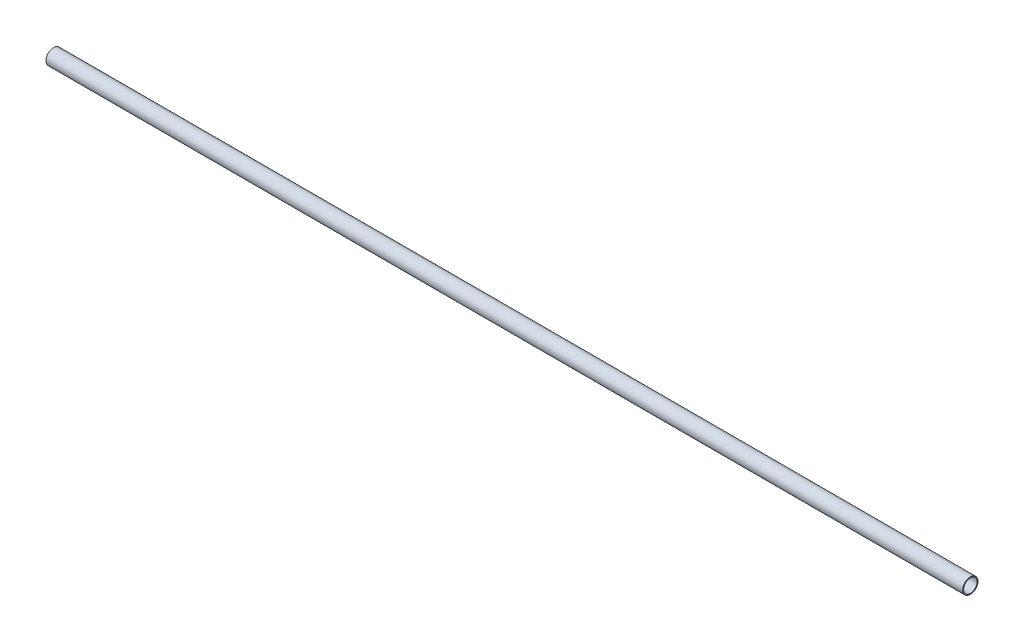
ISO-10303-21;
HEADER;
FILE_DESCRIPTION(('STEP AP214'),'2;1');
FILE_NAME('part.step','',(''),(''),'','','');
FILE_SCHEMA(('AUTOMOTIVE_DESIGN { 1 0 10303 214 1 1 1 1 }'));
ENDSEC;
DATA;
#1=APPLICATION_CONTEXT('core data for automotive mechanical design processes');
#2=APPLICATION_PROTOCOL_DEFINITION('international standard','automotive_design',2000,#1);
#3=PRODUCT_CONTEXT('',#1,'mechanical');
#4=PRODUCT('Part','Part','',(#3));
#5=PRODUCT_RELATED_PRODUCT_CATEGORY('part','',(#4));
#6=PRODUCT_DEFINITION_FORMATION('','',#4);
#7=PRODUCT_DEFINITION_CONTEXT('part definition',#1,'design');
#8=PRODUCT_DEFINITION('design','',#6,#7);
#9=PRODUCT_DEFINITION_SHAPE('','',#8);
#10=(LENGTH_UNIT() NAMED_UNIT(*) SI_UNIT(.MILLI.,.METRE.));
#11=(NAMED_UNIT(*) PLANE_ANGLE_UNIT() SI_UNIT($,.RADIAN.));
#12=(NAMED_UNIT(*) SI_UNIT($,.STERADIAN.) SOLID_ANGLE_UNIT());
#13=UNCERTAINTY_MEASURE_WITH_UNIT(LENGTH_MEASURE(1.E-05),#10,'distance_accuracy_value','');
#14=(GEOMETRIC_REPRESENTATION_CONTEXT(3) GLOBAL_UNCERTAINTY_ASSIGNED_CONTEXT((#13)) GLOBAL_UNIT_ASSIGNED_CONTEXT((#10,
#11,#12)) REPRESENTATION_CONTEXT('',''));
#15=CARTESIAN_POINT('',(0.,0.,0.));
#16=DIRECTION('',(0.,0.,1.));
#17=DIRECTION('',(1.,0.,0.));
#18=AXIS2_PLACEMENT_3D('',#15,#16,#17);
#19=CARTESIAN_POINT('',(1500.,0.,0.));
#20=DIRECTION('',(1.,0.,0.));
#21=DIRECTION('',(0.,0.,-1.));
#22=AXIS2_PLACEMENT_3D('',#19,#20,#21);
#23=PLANE('',#22);
#24=CARTESIAN_POINT('',(1500.,0.,0.));
#25=DIRECTION('',(1.,0.,0.));
#26=DIRECTION('',(0.,0.,-1.));
#27=AXIS2_PLACEMENT_3D('',#24,#25,#26);
#28=CIRCLE('',#27,12.5);
#29=CARTESIAN_POINT('',(1500.,0.,-12.5));
#30=VERTEX_POINT('',#29);
#31=EDGE_CURVE('E10',#30,#30,#28,.T.);
#32=ORIENTED_EDGE('',*,*,#31,.T.);
#33=EDGE_LOOP('',(#32));
#34=FACE_BOUND('',#33,.T.);
#35=CARTESIAN_POINT('',(1500.,0.,0.));
#36=DIRECTION('',(1.,0.,0.));
#37=DIRECTION('',(0.,0.,-1.));
#38=AXIS2_PLACEMENT_3D('',#35,#36,#37);
#39=CIRCLE('',#38,11.);
#40=CARTESIAN_POINT('',(1500.,0.,-11.));
#41=VERTEX_POINT('',#40);
#42=EDGE_CURVE('E43',#41,#41,#39,.T.);
#43=ORIENTED_EDGE('',*,*,#42,.F.);
#44=EDGE_LOOP('',(#43));
#45=FACE_BOUND('',#44,.T.);
#46=ADVANCED_FACE('F32',(#34,#45),#23,.T.);
#47=CARTESIAN_POINT('',(0.,0.,0.));
#48=DIRECTION('',(1.,0.,0.));
#49=DIRECTION('',(0.,0.,-1.));
#50=AXIS2_PLACEMENT_3D('',#47,#48,#49);
#51=PLANE('',#50);
#52=CARTESIAN_POINT('',(0.,0.,0.));
#53=DIRECTION('',(1.,0.,0.));
#54=DIRECTION('',(0.,0.,-1.));
#55=AXIS2_PLACEMENT_3D('',#52,#53,#54);
#56=CIRCLE('',#55,12.5);
#57=CARTESIAN_POINT('',(0.,0.,-12.5));
#58=VERTEX_POINT('',#57);
#59=EDGE_CURVE('E36',#58,#58,#56,.T.);
#60=ORIENTED_EDGE('',*,*,#59,.F.);
#61=EDGE_LOOP('',(#60));
#62=FACE_BOUND('',#61,.T.);
#63=CARTESIAN_POINT('',(0.,0.,0.));
#64=DIRECTION('',(1.,0.,0.));
#65=DIRECTION('',(0.,0.,-1.));
#66=AXIS2_PLACEMENT_3D('',#63,#64,#65);
#67=CIRCLE('',#66,11.);
#68=CARTESIAN_POINT('',(0.,0.,-11.));
#69=VERTEX_POINT('',#68);
#70=EDGE_CURVE('E45',#69,#69,#67,.T.);
#71=ORIENTED_EDGE('',*,*,#70,.T.);
#72=EDGE_LOOP('',(#71));
#73=FACE_BOUND('',#72,.T.);
#74=ADVANCED_FACE('F55',(#62,#73),#51,.F.);
#75=CARTESIAN_POINT('',(1500.,0.,0.));
#76=DIRECTION('',(-1.,0.,0.));
#77=DIRECTION('',(0.,0.,1.));
#78=AXIS2_PLACEMENT_3D('',#75,#76,#77);
#79=CYLINDRICAL_SURFACE('',#78,12.5);
#80=ORIENTED_EDGE('',*,*,#31,.F.);
#81=EDGE_LOOP('',(#80));
#82=FACE_BOUND('',#81,.T.);
#83=ORIENTED_EDGE('',*,*,#59,.T.);
#84=EDGE_LOOP('',(#83));
#85=FACE_BOUND('',#84,.T.);
#86=ADVANCED_FACE('F34',(#82,#85),#79,.T.);
#87=CARTESIAN_POINT('',(1500.,0.,0.));
#88=DIRECTION('',(-1.,0.,0.));
#89=DIRECTION('',(0.,0.,1.));
#90=AXIS2_PLACEMENT_3D('',#87,#88,#89);
#91=CYLINDRICAL_SURFACE('',#90,11.);
#92=ORIENTED_EDGE('',*,*,#42,.T.);
#93=EDGE_LOOP('',(#92));
#94=FACE_BOUND('',#93,.T.);
#95=ORIENTED_EDGE('',*,*,#70,.F.);
#96=EDGE_LOOP('',(#95));
#97=FACE_BOUND('',#96,.T.);
#98=ADVANCED_FACE('F51',(#94,#97),#91,.F.);
#99=CLOSED_SHELL('',(#46,#74,#86,#98));
#100=MANIFOLD_SOLID_BREP('B2',#99);
#101=ADVANCED_BREP_SHAPE_REPRESENTATION('',(#18,#100),#14);
#102=SHAPE_DEFINITION_REPRESENTATION(#9,#101);
ENDSEC;
END-ISO-10303-21;
